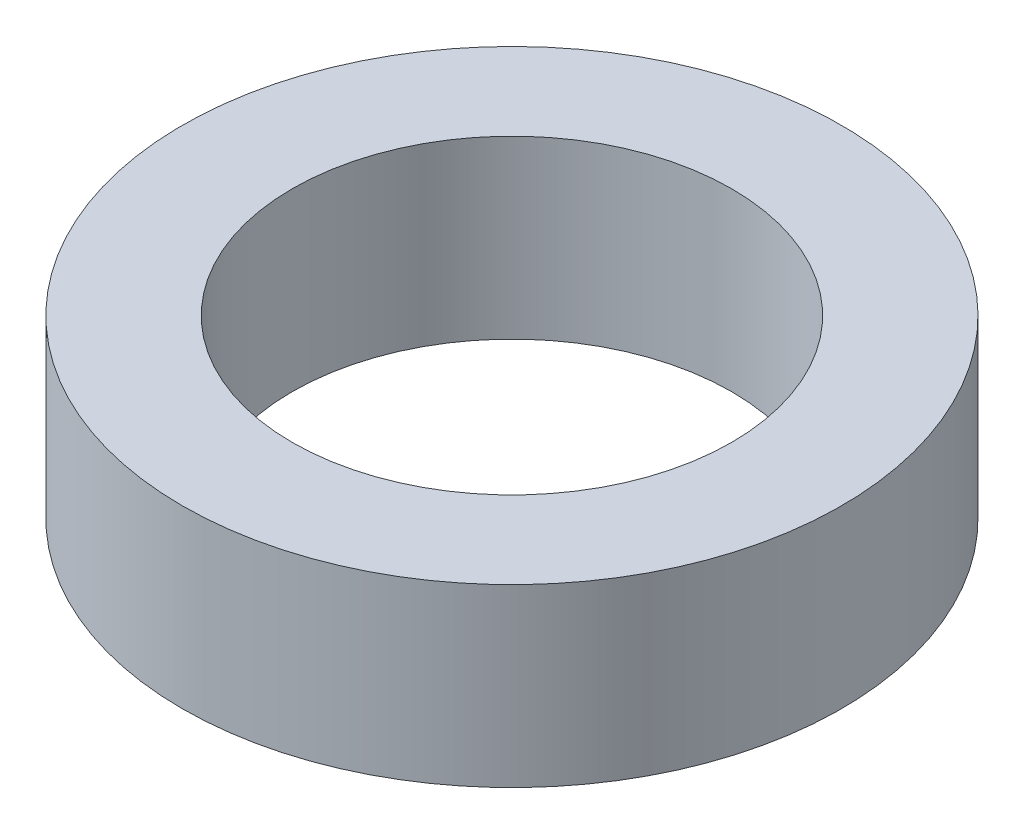
ISO-10303-21;
HEADER;
FILE_DESCRIPTION(('STEP AP214'),'2;1');
FILE_NAME('part.step','',(''),(''),'','','');
FILE_SCHEMA(('AUTOMOTIVE_DESIGN { 1 0 10303 214 1 1 1 1 }'));
ENDSEC;
DATA;
#1=APPLICATION_CONTEXT('core data for automotive mechanical design processes');
#2=APPLICATION_PROTOCOL_DEFINITION('international standard','automotive_design',2000,#1);
#3=PRODUCT_CONTEXT('',#1,'mechanical');
#4=PRODUCT('Part','Part','',(#3));
#5=PRODUCT_RELATED_PRODUCT_CATEGORY('part','',(#4));
#6=PRODUCT_DEFINITION_FORMATION('','',#4);
#7=PRODUCT_DEFINITION_CONTEXT('part definition',#1,'design');
#8=PRODUCT_DEFINITION('design','',#6,#7);
#9=PRODUCT_DEFINITION_SHAPE('','',#8);
#10=(LENGTH_UNIT() NAMED_UNIT(*) SI_UNIT(.MILLI.,.METRE.));
#11=(NAMED_UNIT(*) PLANE_ANGLE_UNIT() SI_UNIT($,.RADIAN.));
#12=(NAMED_UNIT(*) SI_UNIT($,.STERADIAN.) SOLID_ANGLE_UNIT());
#13=UNCERTAINTY_MEASURE_WITH_UNIT(LENGTH_MEASURE(1.E-05),#10,'distance_accuracy_value','');
#14=(GEOMETRIC_REPRESENTATION_CONTEXT(3) GLOBAL_UNCERTAINTY_ASSIGNED_CONTEXT((#13)) GLOBAL_UNIT_ASSIGNED_CONTEXT((#10,
#11,#12)) REPRESENTATION_CONTEXT('',''));
#15=CARTESIAN_POINT('',(0.,0.,0.));
#16=DIRECTION('',(0.,0.,1.));
#17=DIRECTION('',(1.,0.,0.));
#18=AXIS2_PLACEMENT_3D('',#15,#16,#17);
#19=CARTESIAN_POINT('',(0.,4.,0.));
#20=DIRECTION('',(0.,1.,0.));
#21=DIRECTION('',(0.,0.,1.));
#22=AXIS2_PLACEMENT_3D('',#19,#20,#21);
#23=PLANE('',#22);
#24=CARTESIAN_POINT('',(0.,4.,0.));
#25=DIRECTION('',(0.,1.,0.));
#26=DIRECTION('',(0.,0.,1.));
#27=AXIS2_PLACEMENT_3D('',#24,#25,#26);
#28=CIRCLE('',#27,7.5);
#29=CARTESIAN_POINT('',(0.,4.,7.5));
#30=VERTEX_POINT('',#29);
#31=EDGE_CURVE('E10',#30,#30,#28,.T.);
#32=ORIENTED_EDGE('',*,*,#31,.T.);
#33=EDGE_LOOP('',(#32));
#34=FACE_BOUND('',#33,.T.);
#35=CARTESIAN_POINT('',(0.,4.,0.));
#36=DIRECTION('',(0.,1.,0.));
#37=DIRECTION('',(0.,0.,1.));
#38=AXIS2_PLACEMENT_3D('',#35,#36,#37);
#39=CIRCLE('',#38,5.);
#40=CARTESIAN_POINT('',(0.,4.,5.));
#41=VERTEX_POINT('',#40);
#42=EDGE_CURVE('E57',#41,#41,#39,.T.);
#43=ORIENTED_EDGE('',*,*,#42,.F.);
#44=EDGE_LOOP('',(#43));
#45=FACE_BOUND('',#44,.T.);
#46=ADVANCED_FACE('F43',(#34,#45),#23,.T.);
#47=CARTESIAN_POINT('',(0.,0.,0.));
#48=DIRECTION('',(0.,1.,0.));
#49=DIRECTION('',(0.,0.,1.));
#50=AXIS2_PLACEMENT_3D('',#47,#48,#49);
#51=PLANE('',#50);
#52=CARTESIAN_POINT('',(0.,0.,0.));
#53=DIRECTION('',(0.,1.,0.));
#54=DIRECTION('',(0.,0.,1.));
#55=AXIS2_PLACEMENT_3D('',#52,#53,#54);
#56=CIRCLE('',#55,7.5);
#57=CARTESIAN_POINT('',(0.,0.,7.5));
#58=VERTEX_POINT('',#57);
#59=EDGE_CURVE('E50',#58,#58,#56,.T.);
#60=ORIENTED_EDGE('',*,*,#59,.F.);
#61=EDGE_LOOP('',(#60));
#62=FACE_BOUND('',#61,.T.);
#63=CARTESIAN_POINT('',(0.,0.,0.));
#64=DIRECTION('',(0.,1.,0.));
#65=DIRECTION('',(0.,0.,1.));
#66=AXIS2_PLACEMENT_3D('',#63,#64,#65);
#67=CIRCLE('',#66,5.);
#68=CARTESIAN_POINT('',(0.,0.,5.));
#69=VERTEX_POINT('',#68);
#70=EDGE_CURVE('E59',#69,#69,#67,.T.);
#71=ORIENTED_EDGE('',*,*,#70,.T.);
#72=EDGE_LOOP('',(#71));
#73=FACE_BOUND('',#72,.T.);
#74=ADVANCED_FACE('F68',(#62,#73),#51,.F.);
#75=CARTESIAN_POINT('',(0.,4.,0.));
#76=DIRECTION('',(0.,-1.,0.));
#77=DIRECTION('',(0.,0.,-1.));
#78=AXIS2_PLACEMENT_3D('',#75,#76,#77);
#79=CYLINDRICAL_SURFACE('',#78,7.5);
#80=ORIENTED_EDGE('',*,*,#31,.F.);
#81=EDGE_LOOP('',(#80));
#82=FACE_BOUND('',#81,.T.);
#83=ORIENTED_EDGE('',*,*,#59,.T.);
#84=EDGE_LOOP('',(#83));
#85=FACE_BOUND('',#84,.T.);
#86=ADVANCED_FACE('F44',(#82,#85),#79,.T.);
#87=CARTESIAN_POINT('',(0.,4.,0.));
#88=DIRECTION('',(0.,-1.,0.));
#89=DIRECTION('',(0.,0.,-1.));
#90=AXIS2_PLACEMENT_3D('',#87,#88,#89);
#91=CYLINDRICAL_SURFACE('',#90,5.);
#92=ORIENTED_EDGE('',*,*,#42,.T.);
#93=EDGE_LOOP('',(#92));
#94=FACE_BOUND('',#93,.T.);
#95=ORIENTED_EDGE('',*,*,#70,.F.);
#96=EDGE_LOOP('',(#95));
#97=FACE_BOUND('',#96,.T.);
#98=ADVANCED_FACE('F67',(#94,#97),#91,.F.);
#99=CLOSED_SHELL('',(#46,#74,#86,#98));
#100=MANIFOLD_SOLID_BREP('B2',#99);
#101=ADVANCED_BREP_SHAPE_REPRESENTATION('',(#18,#100),#14);
#102=SHAPE_DEFINITION_REPRESENTATION(#9,#101);
ENDSEC;
END-ISO-10303-21;
